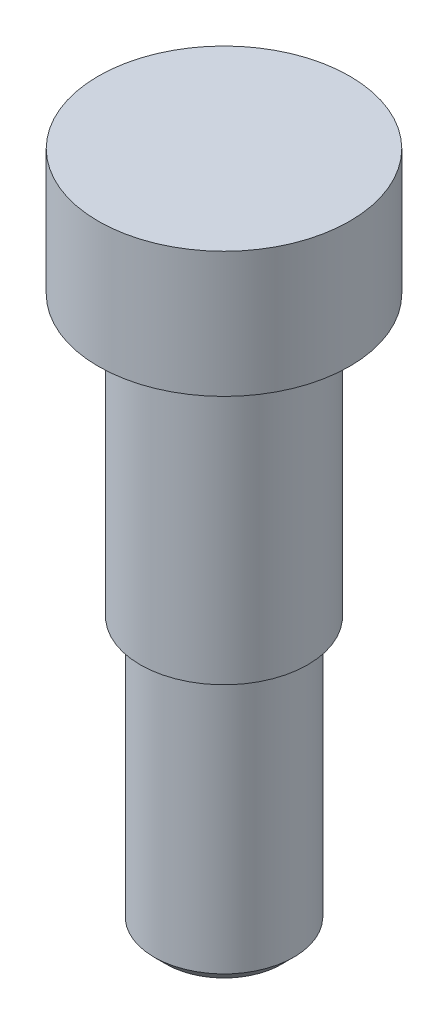
ISO-10303-21;
HEADER;
FILE_DESCRIPTION(('STEP AP214'),'2;1');
FILE_NAME('part.step','',(''),(''),'','','');
FILE_SCHEMA(('AUTOMOTIVE_DESIGN { 1 0 10303 214 1 1 1 1 }'));
ENDSEC;
DATA;
#1=APPLICATION_CONTEXT('core data for automotive mechanical design processes');
#2=APPLICATION_PROTOCOL_DEFINITION('international standard','automotive_design',2000,#1);
#3=PRODUCT_CONTEXT('',#1,'mechanical');
#4=PRODUCT('Part','Part','',(#3));
#5=PRODUCT_RELATED_PRODUCT_CATEGORY('part','',(#4));
#6=PRODUCT_DEFINITION_FORMATION('','',#4);
#7=PRODUCT_DEFINITION_CONTEXT('part definition',#1,'design');
#8=PRODUCT_DEFINITION('design','',#6,#7);
#9=PRODUCT_DEFINITION_SHAPE('','',#8);
#10=(LENGTH_UNIT() NAMED_UNIT(*) SI_UNIT(.MILLI.,.METRE.));
#11=(NAMED_UNIT(*) PLANE_ANGLE_UNIT() SI_UNIT($,.RADIAN.));
#12=(NAMED_UNIT(*) SI_UNIT($,.STERADIAN.) SOLID_ANGLE_UNIT());
#13=UNCERTAINTY_MEASURE_WITH_UNIT(LENGTH_MEASURE(1.E-05),#10,'distance_accuracy_value','');
#14=(GEOMETRIC_REPRESENTATION_CONTEXT(3) GLOBAL_UNCERTAINTY_ASSIGNED_CONTEXT((#13)) GLOBAL_UNIT_ASSIGNED_CONTEXT((#10,
#11,#12)) REPRESENTATION_CONTEXT('',''));
#15=CARTESIAN_POINT('',(0.,0.,0.));
#16=DIRECTION('',(0.,0.,1.));
#17=DIRECTION('',(1.,0.,0.));
#18=AXIS2_PLACEMENT_3D('',#15,#16,#17);
#19=CARTESIAN_POINT('',(0.,24.25,0.));
#20=DIRECTION('',(0.,1.,0.));
#21=DIRECTION('',(0.,0.,1.));
#22=AXIS2_PLACEMENT_3D('',#19,#20,#21);
#23=PLANE('',#22);
#24=CARTESIAN_POINT('',(0.,24.25,0.));
#25=DIRECTION('',(0.,-1.,0.));
#26=DIRECTION('',(0.,0.,-1.));
#27=AXIS2_PLACEMENT_3D('',#24,#25,#26);
#28=CIRCLE('',#27,4.5);
#29=CARTESIAN_POINT('',(0.,24.25,-4.5));
#30=VERTEX_POINT('',#29);
#31=EDGE_CURVE('E10',#30,#30,#28,.T.);
#32=ORIENTED_EDGE('',*,*,#31,.F.);
#33=EDGE_LOOP('',(#32));
#34=FACE_BOUND('',#33,.T.);
#35=ADVANCED_FACE('F39',(#34),#23,.T.);
#36=CARTESIAN_POINT('',(0.,0.,0.));
#37=DIRECTION('',(0.,-1.,0.));
#38=DIRECTION('',(0.,0.,-1.));
#39=AXIS2_PLACEMENT_3D('',#36,#37,#38);
#40=CYLINDRICAL_SURFACE('',#39,4.5);
#41=ORIENTED_EDGE('',*,*,#31,.T.);
#42=EDGE_LOOP('',(#41));
#43=FACE_BOUND('',#42,.T.);
#44=CARTESIAN_POINT('',(0.,19.75,0.));
#45=DIRECTION('',(0.,-1.,0.));
#46=DIRECTION('',(0.,0.,-1.));
#47=AXIS2_PLACEMENT_3D('',#44,#45,#46);
#48=CIRCLE('',#47,4.5);
#49=CARTESIAN_POINT('',(0.,19.75,-4.5));
#50=VERTEX_POINT('',#49);
#51=EDGE_CURVE('E46',#50,#50,#48,.T.);
#52=ORIENTED_EDGE('',*,*,#51,.F.);
#53=EDGE_LOOP('',(#52));
#54=FACE_BOUND('',#53,.T.);
#55=ADVANCED_FACE('F81',(#43,#54),#40,.T.);
#56=CARTESIAN_POINT('',(4.5,19.75,0.));
#57=DIRECTION('',(0.,-1.,0.));
#58=DIRECTION('',(0.,0.,-1.));
#59=AXIS2_PLACEMENT_3D('',#56,#57,#58);
#60=PLANE('',#59);
#61=ORIENTED_EDGE('',*,*,#51,.T.);
#62=EDGE_LOOP('',(#61));
#63=FACE_BOUND('',#62,.T.);
#64=CARTESIAN_POINT('',(0.,19.75,0.));
#65=DIRECTION('',(0.,-1.,0.));
#66=DIRECTION('',(0.,0.,-1.));
#67=AXIS2_PLACEMENT_3D('',#64,#65,#66);
#68=CIRCLE('',#67,3.);
#69=CARTESIAN_POINT('',(0.,19.75,-3.));
#70=VERTEX_POINT('',#69);
#71=EDGE_CURVE('E50',#70,#70,#68,.T.);
#72=ORIENTED_EDGE('',*,*,#71,.F.);
#73=EDGE_LOOP('',(#72));
#74=FACE_BOUND('',#73,.T.);
#75=ADVANCED_FACE('F86',(#63,#74),#60,.T.);
#76=CARTESIAN_POINT('',(0.,0.,0.));
#77=DIRECTION('',(0.,-1.,0.));
#78=DIRECTION('',(0.,0.,-1.));
#79=AXIS2_PLACEMENT_3D('',#76,#77,#78);
#80=CYLINDRICAL_SURFACE('',#79,3.);
#81=ORIENTED_EDGE('',*,*,#71,.T.);
#82=EDGE_LOOP('',(#81));
#83=FACE_BOUND('',#82,.T.);
#84=CARTESIAN_POINT('',(0.,9.75,0.));
#85=DIRECTION('',(0.,-1.,0.));
#86=DIRECTION('',(0.,0.,-1.));
#87=AXIS2_PLACEMENT_3D('',#84,#85,#86);
#88=CIRCLE('',#87,3.);
#89=CARTESIAN_POINT('',(0.,9.75,-3.));
#90=VERTEX_POINT('',#89);
#91=EDGE_CURVE('E54',#90,#90,#88,.T.);
#92=ORIENTED_EDGE('',*,*,#91,.F.);
#93=EDGE_LOOP('',(#92));
#94=FACE_BOUND('',#93,.T.);
#95=ADVANCED_FACE('F91',(#83,#94),#80,.T.);
#96=CARTESIAN_POINT('',(3.,9.75,0.));
#97=DIRECTION('',(0.,-1.,0.));
#98=DIRECTION('',(0.,0.,-1.));
#99=AXIS2_PLACEMENT_3D('',#96,#97,#98);
#100=PLANE('',#99);
#101=ORIENTED_EDGE('',*,*,#91,.T.);
#102=EDGE_LOOP('',(#101));
#103=FACE_BOUND('',#102,.T.);
#104=CARTESIAN_POINT('',(0.,9.75,0.));
#105=DIRECTION('',(0.,1.,0.));
#106=DIRECTION('',(0.,0.,1.));
#107=AXIS2_PLACEMENT_3D('',#104,#105,#106);
#108=CIRCLE('',#107,2.5);
#109=CARTESIAN_POINT('',(0.,9.75,2.5));
#110=VERTEX_POINT('',#109);
#111=EDGE_CURVE('E59',#110,#110,#108,.T.);
#112=ORIENTED_EDGE('',*,*,#111,.T.);
#113=EDGE_LOOP('',(#112));
#114=FACE_BOUND('',#113,.T.);
#115=ADVANCED_FACE('F94',(#103,#114),#100,.T.);
#116=CARTESIAN_POINT('',(0.,0.,0.));
#117=DIRECTION('',(0.,1.,0.));
#118=DIRECTION('',(0.,0.,1.));
#119=AXIS2_PLACEMENT_3D('',#116,#117,#118);
#120=CYLINDRICAL_SURFACE('',#119,2.5);
#121=ORIENTED_EDGE('',*,*,#111,.F.);
#122=EDGE_LOOP('',(#121));
#123=FACE_BOUND('',#122,.T.);
#124=CARTESIAN_POINT('',(0.,0.432999999999998,0.));
#125=DIRECTION('',(0.,1.,0.));
#126=DIRECTION('',(0.,0.,1.));
#127=AXIS2_PLACEMENT_3D('',#124,#125,#126);
#128=CIRCLE('',#127,2.5);
#129=CARTESIAN_POINT('',(0.,0.432999999999998,2.5));
#130=VERTEX_POINT('',#129);
#131=EDGE_CURVE('E65',#130,#130,#128,.T.);
#132=ORIENTED_EDGE('',*,*,#131,.T.);
#133=EDGE_LOOP('',(#132));
#134=FACE_BOUND('',#133,.T.);
#135=ADVANCED_FACE('F69',(#123,#134),#120,.T.);
#136=CARTESIAN_POINT('',(0.,0.,0.));
#137=DIRECTION('',(0.,1.,0.));
#138=DIRECTION('',(0.,0.,1.));
#139=AXIS2_PLACEMENT_3D('',#136,#137,#138);
#140=CONICAL_SURFACE('',#139,2.067,0.785398163397449);
#141=ORIENTED_EDGE('',*,*,#131,.F.);
#142=EDGE_LOOP('',(#141));
#143=FACE_BOUND('',#142,.T.);
#144=CARTESIAN_POINT('',(0.,0.,0.));
#145=DIRECTION('',(0.,1.,0.));
#146=DIRECTION('',(0.,0.,1.));
#147=AXIS2_PLACEMENT_3D('',#144,#145,#146);
#148=CIRCLE('',#147,2.067);
#149=CARTESIAN_POINT('',(0.,0.,2.067));
#150=VERTEX_POINT('',#149);
#151=EDGE_CURVE('E62',#150,#150,#148,.T.);
#152=ORIENTED_EDGE('',*,*,#151,.T.);
#153=EDGE_LOOP('',(#152));
#154=FACE_BOUND('',#153,.T.);
#155=ADVANCED_FACE('F71',(#143,#154),#140,.T.);
#156=CARTESIAN_POINT('',(2.8,0.,0.));
#157=DIRECTION('',(0.,-1.,0.));
#158=DIRECTION('',(0.,0.,-1.));
#159=AXIS2_PLACEMENT_3D('',#156,#157,#158);
#160=PLANE('',#159);
#161=ORIENTED_EDGE('',*,*,#151,.F.);
#162=EDGE_LOOP('',(#161));
#163=FACE_BOUND('',#162,.T.);
#164=ADVANCED_FACE('F41',(#163),#160,.T.);
#165=CLOSED_SHELL('',(#35,#55,#75,#95,#115,#135,#155,#164));
#166=MANIFOLD_SOLID_BREP('B2',#165);
#167=ADVANCED_BREP_SHAPE_REPRESENTATION('',(#18,#166),#14);
#168=SHAPE_DEFINITION_REPRESENTATION(#9,#167);
ENDSEC;
END-ISO-10303-21;
